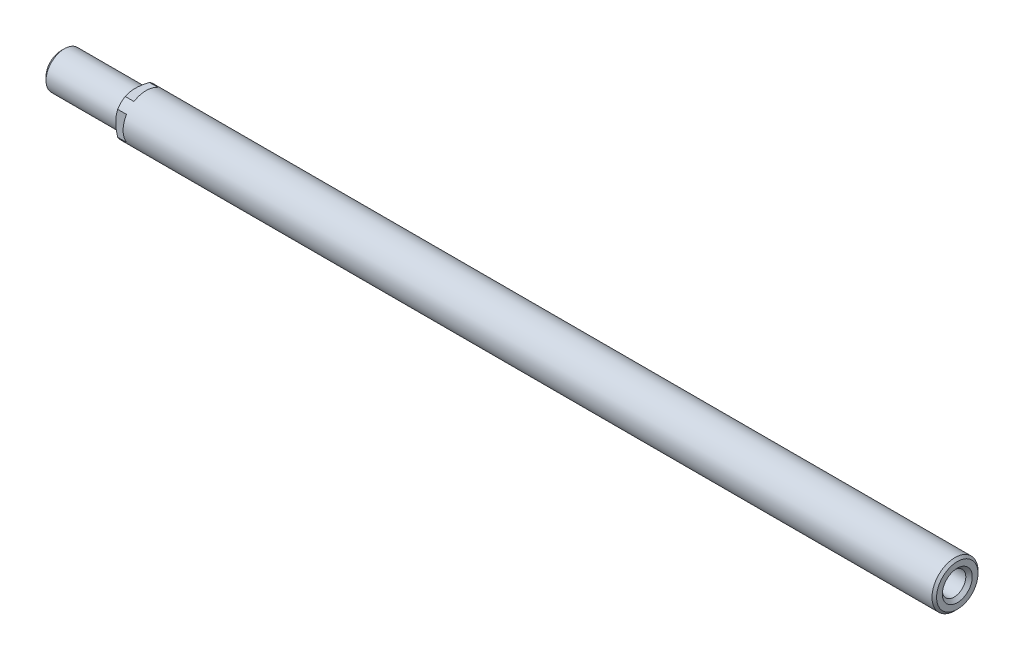
ISO-10303-21;
HEADER;
FILE_DESCRIPTION(('STEP AP214'),'2;1');
FILE_NAME('part.step','',(''),(''),'','','');
FILE_SCHEMA(('AUTOMOTIVE_DESIGN { 1 0 10303 214 1 1 1 1 }'));
ENDSEC;
DATA;
#1=APPLICATION_CONTEXT('core data for automotive mechanical design processes');
#2=APPLICATION_PROTOCOL_DEFINITION('international standard','automotive_design',2000,#1);
#3=PRODUCT_CONTEXT('',#1,'mechanical');
#4=PRODUCT('Part','Part','',(#3));
#5=PRODUCT_RELATED_PRODUCT_CATEGORY('part','',(#4));
#6=PRODUCT_DEFINITION_FORMATION('','',#4);
#7=PRODUCT_DEFINITION_CONTEXT('part definition',#1,'design');
#8=PRODUCT_DEFINITION('design','',#6,#7);
#9=PRODUCT_DEFINITION_SHAPE('','',#8);
#10=(LENGTH_UNIT() NAMED_UNIT(*) SI_UNIT(.MILLI.,.METRE.));
#11=(NAMED_UNIT(*) PLANE_ANGLE_UNIT() SI_UNIT($,.RADIAN.));
#12=(NAMED_UNIT(*) SI_UNIT($,.STERADIAN.) SOLID_ANGLE_UNIT());
#13=UNCERTAINTY_MEASURE_WITH_UNIT(LENGTH_MEASURE(1.E-05),#10,'distance_accuracy_value','');
#14=(GEOMETRIC_REPRESENTATION_CONTEXT(3) GLOBAL_UNCERTAINTY_ASSIGNED_CONTEXT((#13)) GLOBAL_UNIT_ASSIGNED_CONTEXT((#10,
#11,#12)) REPRESENTATION_CONTEXT('',''));
#15=CARTESIAN_POINT('',(0.,0.,0.));
#16=DIRECTION('',(0.,0.,1.));
#17=DIRECTION('',(1.,0.,0.));
#18=AXIS2_PLACEMENT_3D('',#15,#16,#17);
#19=CARTESIAN_POINT('',(-357.5,0.,94.635912223386));
#20=DIRECTION('',(1.,0.,0.));
#21=DIRECTION('',(0.,0.,-1.));
#22=AXIS2_PLACEMENT_3D('',#19,#20,#21);
#23=CYLINDRICAL_SURFACE('',#22,9.99999999999999);
#24=CARTESIAN_POINT('',(-1.,0.,94.635912223386));
#25=DIRECTION('',(1.,0.,0.));
#26=DIRECTION('',(0.,0.,-1.));
#27=AXIS2_PLACEMENT_3D('',#24,#25,#26);
#28=CIRCLE('',#27,9.99999999999999);
#29=CARTESIAN_POINT('',(-1.,0.,84.635912223386));
#30=VERTEX_POINT('',#29);
#31=EDGE_CURVE('E11',#30,#30,#28,.F.);
#32=ORIENTED_EDGE('',*,*,#31,.T.);
#33=EDGE_LOOP('',(#32));
#34=FACE_BOUND('',#33,.T.);
#35=CARTESIAN_POINT('',(-352.5,0.,94.635912223386));
#36=DIRECTION('',(-1.,0.,0.));
#37=DIRECTION('',(0.,0.,1.));
#38=AXIS2_PLACEMENT_3D('',#35,#36,#37);
#39=CIRCLE('',#38,9.99999999999999);
#40=CARTESIAN_POINT('',(-352.5,5.26782687642635,103.135912223386));
#41=VERTEX_POINT('',#40);
#42=CARTESIAN_POINT('',(-352.5,-5.26782687642635,103.135912223386));
#43=VERTEX_POINT('',#42);
#44=EDGE_CURVE('E232',#41,#43,#39,.F.);
#45=ORIENTED_EDGE('',*,*,#44,.T.);
#46=DIRECTION('',(1.,0.,0.));
#47=VECTOR('',#46,1.);
#48=CARTESIAN_POINT('',(-357.5,-5.26782687642635,103.135912223386));
#49=LINE('',#48,#47);
#50=CARTESIAN_POINT('',(-356.345299461621,-5.26782687642635,103.135912223386));
#51=VERTEX_POINT('',#50);
#52=EDGE_CURVE('E163',#43,#51,#49,.F.);
#53=ORIENTED_EDGE('',*,*,#52,.T.);
#54=CARTESIAN_POINT('',(-356.345299461621,0.,94.635912223386));
#55=DIRECTION('',(1.,0.,0.));
#56=DIRECTION('',(0.,0.,-1.));
#57=AXIS2_PLACEMENT_3D('',#54,#55,#56);
#58=CIRCLE('',#57,9.99999999999999);
#59=CARTESIAN_POINT('',(-356.345299461621,-8.5,99.9037390998124));
#60=VERTEX_POINT('',#59);
#61=EDGE_CURVE('E250',#51,#60,#58,.T.);
#62=ORIENTED_EDGE('',*,*,#61,.T.);
#63=DIRECTION('',(1.,0.,0.));
#64=VECTOR('',#63,1.);
#65=CARTESIAN_POINT('',(-357.5,-8.5,99.9037390998124));
#66=LINE('',#65,#64);
#67=CARTESIAN_POINT('',(-352.5,-8.5,99.9037390998124));
#68=VERTEX_POINT('',#67);
#69=EDGE_CURVE('E75',#60,#68,#66,.T.);
#70=ORIENTED_EDGE('',*,*,#69,.T.);
#71=CARTESIAN_POINT('',(-352.5,-8.5,89.3680853469597));
#72=VERTEX_POINT('',#71);
#73=EDGE_CURVE('E237',#68,#72,#39,.F.);
#74=ORIENTED_EDGE('',*,*,#73,.T.);
#75=DIRECTION('',(1.,0.,0.));
#76=VECTOR('',#75,1.);
#77=CARTESIAN_POINT('',(-357.5,-8.5,89.3680853469597));
#78=LINE('',#77,#76);
#79=CARTESIAN_POINT('',(-356.345299461621,-8.5,89.3680853469597));
#80=VERTEX_POINT('',#79);
#81=EDGE_CURVE('E157',#72,#80,#78,.F.);
#82=ORIENTED_EDGE('',*,*,#81,.T.);
#83=CARTESIAN_POINT('',(-356.345299461621,-5.26782687642637,86.135912223386));
#84=VERTEX_POINT('',#83);
#85=EDGE_CURVE('E175',#80,#84,#58,.T.);
#86=ORIENTED_EDGE('',*,*,#85,.T.);
#87=DIRECTION('',(1.,0.,0.));
#88=VECTOR('',#87,1.);
#89=CARTESIAN_POINT('',(-357.5,-5.26782687642637,86.135912223386));
#90=LINE('',#89,#88);
#91=CARTESIAN_POINT('',(-352.5,-5.26782687642637,86.135912223386));
#92=VERTEX_POINT('',#91);
#93=EDGE_CURVE('E67',#84,#92,#90,.T.);
#94=ORIENTED_EDGE('',*,*,#93,.T.);
#95=CARTESIAN_POINT('',(-352.5,5.26782687642637,86.135912223386));
#96=VERTEX_POINT('',#95);
#97=EDGE_CURVE('E231',#92,#96,#39,.F.);
#98=ORIENTED_EDGE('',*,*,#97,.T.);
#99=DIRECTION('',(1.,0.,0.));
#100=VECTOR('',#99,1.);
#101=CARTESIAN_POINT('',(-357.5,5.26782687642637,86.135912223386));
#102=LINE('',#101,#100);
#103=CARTESIAN_POINT('',(-356.345299461621,5.26782687642637,86.135912223386));
#104=VERTEX_POINT('',#103);
#105=EDGE_CURVE('E153',#96,#104,#102,.F.);
#106=ORIENTED_EDGE('',*,*,#105,.T.);
#107=CARTESIAN_POINT('',(-356.345299461621,8.5,89.3680853469597));
#108=VERTEX_POINT('',#107);
#109=EDGE_CURVE('E176',#104,#108,#58,.T.);
#110=ORIENTED_EDGE('',*,*,#109,.T.);
#111=DIRECTION('',(1.,0.,0.));
#112=VECTOR('',#111,1.);
#113=CARTESIAN_POINT('',(-357.5,8.5,89.3680853469597));
#114=LINE('',#113,#112);
#115=CARTESIAN_POINT('',(-352.5,8.5,89.3680853469597));
#116=VERTEX_POINT('',#115);
#117=EDGE_CURVE('E146',#108,#116,#114,.T.);
#118=ORIENTED_EDGE('',*,*,#117,.T.);
#119=CARTESIAN_POINT('',(-352.5,8.5,99.9037390998124));
#120=VERTEX_POINT('',#119);
#121=EDGE_CURVE('E224',#116,#120,#39,.F.);
#122=ORIENTED_EDGE('',*,*,#121,.T.);
#123=DIRECTION('',(1.,0.,0.));
#124=VECTOR('',#123,1.);
#125=CARTESIAN_POINT('',(-357.5,8.5,99.9037390998124));
#126=LINE('',#125,#124);
#127=CARTESIAN_POINT('',(-356.345299461621,8.5,99.9037390998124));
#128=VERTEX_POINT('',#127);
#129=EDGE_CURVE('E149',#120,#128,#126,.F.);
#130=ORIENTED_EDGE('',*,*,#129,.T.);
#131=CARTESIAN_POINT('',(-356.345299461621,5.26782687642635,103.135912223386));
#132=VERTEX_POINT('',#131);
#133=EDGE_CURVE('E180',#128,#132,#58,.T.);
#134=ORIENTED_EDGE('',*,*,#133,.T.);
#135=DIRECTION('',(1.,0.,0.));
#136=VECTOR('',#135,1.);
#137=CARTESIAN_POINT('',(-357.5,5.26782687642635,103.135912223386));
#138=LINE('',#137,#136);
#139=EDGE_CURVE('E160',#132,#41,#138,.T.);
#140=ORIENTED_EDGE('',*,*,#139,.T.);
#141=EDGE_LOOP('',(#45,#53,#62,#70,#74,#82,#86,#94,#98,#106,#110,#118,#122,#130,#134,#140));
#142=FACE_BOUND('',#141,.T.);
#143=ADVANCED_FACE('F51',(#34,#142),#23,.T.);
#144=CARTESIAN_POINT('',(-356.345299461621,0.,94.635912223386));
#145=DIRECTION('',(1.,0.,0.));
#146=DIRECTION('',(0.,0.,-1.));
#147=AXIS2_PLACEMENT_3D('',#144,#145,#146);
#148=CONICAL_SURFACE('',#147,9.99999999999999,1.0471975511966);
#149=CARTESIAN_POINT('',(-357.5,0.,94.635912223386));
#150=DIRECTION('',(-1.,0.,0.));
#151=DIRECTION('',(0.,0.,1.));
#152=AXIS2_PLACEMENT_3D('',#149,#150,#151);
#153=CIRCLE('',#152,8.);
#154=CARTESIAN_POINT('',(-357.5,0.,102.635912223386));
#155=VERTEX_POINT('',#154);
#156=EDGE_CURVE('E166',#155,#155,#153,.T.);
#157=ORIENTED_EDGE('',*,*,#156,.F.);
#158=EDGE_LOOP('',(#157));
#159=FACE_BOUND('',#158,.T.);
#160=ORIENTED_EDGE('',*,*,#61,.F.);
#161=CARTESIAN_POINT('',(-346.578430551977,-25.5393705588427,103.135912223386));
#162=CARTESIAN_POINT('',(-346.88872095938,-24.9729070449995,103.135912223386));
#163=CARTESIAN_POINT('',(-347.198253020489,-24.4060262850612,103.135912223386));
#164=CARTESIAN_POINT('',(-347.815395459564,-23.2712091900828,103.135912223386));
#165=CARTESIAN_POINT('',(-348.123005809204,-22.703272839642,103.135912223386));
#166=CARTESIAN_POINT('',(-348.736075081533,-21.5657980028676,103.135912223386));
#167=CARTESIAN_POINT('',(-349.041532598252,-20.9962587581142,103.135912223386));
#168=CARTESIAN_POINT('',(-349.649533659411,-19.8556300467387,103.135912223386));
#169=CARTESIAN_POINT('',(-349.952077221337,-19.2845405894463,103.135912223386));
#170=CARTESIAN_POINT('',(-350.560712653581,-18.1266942784125,103.135912223386));
#171=CARTESIAN_POINT('',(-350.866715309859,-17.5398904706723,103.135912223386));
#172=CARTESIAN_POINT('',(-351.473746674115,-16.3637159119743,103.135912223386));
#173=CARTESIAN_POINT('',(-351.774775418253,-15.7743451797169,103.135912223386));
#174=CARTESIAN_POINT('',(-352.370194397058,-14.5924439563174,103.135912223386));
#175=CARTESIAN_POINT('',(-352.664586319511,-13.9999143170002,103.135912223386));
#176=CARTESIAN_POINT('',(-353.244527216982,-12.8105448689461,103.135912223386));
#177=CARTESIAN_POINT('',(-353.530076517527,-12.2137052198756,103.135912223386));
#178=CARTESIAN_POINT('',(-353.953068508144,-11.3057728520148,103.135912223386));
#179=CARTESIAN_POINT('',(-354.095040084028,-10.9967903709382,103.135912223386));
#180=CARTESIAN_POINT('',(-354.375071413956,-10.3770602051242,103.135912223386));
#181=CARTESIAN_POINT('',(-354.513131236114,-10.066312551237,103.135912223386));
#182=CARTESIAN_POINT('',(-354.784588971702,-9.44267026988265,103.135912223386));
#183=CARTESIAN_POINT('',(-354.917985454887,-9.12977501834432,103.135912223386));
#184=CARTESIAN_POINT('',(-355.179067667644,-8.50160505824018,103.135912223386));
#185=CARTESIAN_POINT('',(-355.306753422883,-8.18633036037644,103.135912223386));
#186=CARTESIAN_POINT('',(-355.554509344887,-7.55468422952636,103.135912223386));
#187=CARTESIAN_POINT('',(-355.674615699213,-7.23832705183361,103.135912223386));
#188=CARTESIAN_POINT('',(-355.906386618322,-6.60250824678508,103.135912223386));
#189=CARTESIAN_POINT('',(-356.018050877312,-6.28304650744781,103.135912223386));
#190=CARTESIAN_POINT('',(-356.230988434202,-5.64075624076507,103.135912223386));
#191=CARTESIAN_POINT('',(-356.332264939071,-5.31792878661615,103.135912223386));
#192=CARTESIAN_POINT('',(-356.522151392389,-4.66860742238785,103.135912223386));
#193=CARTESIAN_POINT('',(-356.610762745368,-4.34211392320038,103.135912223386));
#194=CARTESIAN_POINT('',(-356.805979147793,-3.55015477793816,103.135912223386));
#195=CARTESIAN_POINT('',(-356.905003798878,-3.08274086083429,103.135912223386));
#196=CARTESIAN_POINT('',(-357.024727834735,-2.37685344658361,103.135912223386));
#197=CARTESIAN_POINT('',(-357.059831978699,-2.14078292846202,103.135912223386));
#198=CARTESIAN_POINT('',(-357.119583097318,-1.66730213116706,103.135912223386));
#199=CARTESIAN_POINT('',(-357.144230129539,-1.42989185937617,103.135912223386));
#200=CARTESIAN_POINT('',(-357.182286254934,-0.955269067012634,103.135912223386));
#201=CARTESIAN_POINT('',(-357.195746649176,-0.718060683523938,103.135912223386));
#202=CARTESIAN_POINT('',(-357.211222587448,-0.243270509663267,103.135912223386));
#203=CARTESIAN_POINT('',(-357.213238304856,-0.00568872500254447,103.135912223386));
#204=CARTESIAN_POINT('',(-357.205762188261,0.469307712390111,103.135912223386));
#205=CARTESIAN_POINT('',(-357.196269646519,0.706722353944568,103.135912223386));
#206=CARTESIAN_POINT('',(-357.16606461742,1.1808356650318,103.135912223386));
#207=CARTESIAN_POINT('',(-357.145351643041,1.417534303038,103.135912223386));
#208=CARTESIAN_POINT('',(-357.084178446681,1.97232961308989,103.135912223386));
#209=CARTESIAN_POINT('',(-357.039345763713,2.28994783869428,103.135912223386));
#210=CARTESIAN_POINT('',(-356.932344402941,2.92224742367171,103.135912223386));
#211=CARTESIAN_POINT('',(-356.870173045202,3.23692832126265,103.135912223386));
#212=CARTESIAN_POINT('',(-356.730824698104,3.86322644687351,103.135912223386));
#213=CARTESIAN_POINT('',(-356.653633641361,4.17484051281206,103.135912223386));
#214=CARTESIAN_POINT('',(-356.486651663727,4.79463366863872,103.135912223386));
#215=CARTESIAN_POINT('',(-356.396861052273,5.10281284268496,103.135912223386));
#216=CARTESIAN_POINT('',(-356.204968381648,5.72187175251727,103.135912223386));
#217=CARTESIAN_POINT('',(-356.102660726691,6.03268731743341,103.135912223386));
#218=CARTESIAN_POINT('',(-355.889108917124,6.6512158593428,103.135912223386));
#219=CARTESIAN_POINT('',(-355.77786472633,6.95892882376789,103.135912223386));
#220=CARTESIAN_POINT('',(-355.548096348611,7.57143913080665,103.135912223386));
#221=CARTESIAN_POINT('',(-355.429575782074,7.87623783755669,103.135912223386));
#222=CARTESIAN_POINT('',(-355.186501302108,8.48340799143823,103.135912223386));
#223=CARTESIAN_POINT('',(-355.061947436741,8.78577945788333,103.135912223386));
#224=CARTESIAN_POINT('',(-354.779945127132,9.45460468626431,103.135912223386));
#225=CARTESIAN_POINT('',(-354.621280951485,9.82054485979376,103.135912223386));
#226=CARTESIAN_POINT('',(-354.298022166461,10.5498025588548,103.135912223386));
#227=CARTESIAN_POINT('',(-354.133427338342,10.9131199870566,103.135912223386));
#228=CARTESIAN_POINT('',(-353.799429387273,11.6375869039058,103.135912223386));
#229=CARTESIAN_POINT('',(-353.630025681631,11.9987361233525,103.135912223386));
#230=CARTESIAN_POINT('',(-353.287308687875,12.7191774642907,103.135912223386));
#231=CARTESIAN_POINT('',(-353.113995344823,13.0784695595983,103.135912223386));
#232=CARTESIAN_POINT('',(-352.764017438643,13.7957523410067,103.135912223386));
#233=CARTESIAN_POINT('',(-352.587350439408,14.1537418369145,103.135912223386));
#234=CARTESIAN_POINT('',(-352.23133036454,14.8683836892306,103.135912223386));
#235=CARTESIAN_POINT('',(-352.051977272124,15.2250360372667,103.135912223386));
#236=CARTESIAN_POINT('',(-351.510588963077,16.2932313322632,103.135912223386));
#237=CARTESIAN_POINT('',(-351.145195400773,17.0030722182502,103.135912223386));
#238=CARTESIAN_POINT('',(-350.434505035452,18.3684187926222,103.135912223386));
#239=CARTESIAN_POINT('',(-350.089654797101,19.0241577848791,103.135912223386));
#240=CARTESIAN_POINT('',(-349.395723029492,20.3334100670535,103.135912223386));
#241=CARTESIAN_POINT('',(-349.046641406976,20.9869233075085,103.135912223386));
#242=CARTESIAN_POINT('',(-348.345824944396,22.2910652690949,103.135912223386));
#243=CARTESIAN_POINT('',(-347.994095744745,22.9416970254446,103.135912223386));
#244=CARTESIAN_POINT('',(-347.288047371804,24.2415224317954,103.135912223386));
#245=CARTESIAN_POINT('',(-346.933728296925,24.890716135232,103.135912223386));
#246=CARTESIAN_POINT('',(-346.578430551977,25.5393705588427,103.135912223386));
#247=B_SPLINE_CURVE_WITH_KNOTS('',3,(#161,#162,#163,#164,#165,#166,#167,#168,#169,#170,#171,
#172,#173,#174,#175,#176,#177,#178,#179,#180,#181,#182,#183,#184,#185,#186,#187,#188,#189,#190,
#191,#192,#193,#194,#195,#196,#197,#198,#199,#200,#201,#202,#203,#204,#205,#206,#207,#208,#209,
#210,#211,#212,#213,#214,#215,#216,#217,#218,#219,#220,#221,#222,#223,#224,#225,#226,#227,#228,
#229,#230,#231,#232,#233,#234,#235,#236,#237,#238,#239,#240,#241,#242,#243,#244,#245,#246),
.UNSPECIFIED.,.F.,.F.,(4,2,2,2,2,2,2,2,2,2,2,2,2,2,2,2,2,2,2,2,2,2,2,2,2,2,2,2,2,2,2,2,2,2,2,2,
2,2,2,2,2,2,4),(0.,1.93764201924687,3.87531253339333,5.81414901128492,7.75297384646834,
9.73834961566885,11.7237109452773,13.7085615557447,15.6933390099207,16.7134329930713,
17.7335092024192,18.7538955718854,19.7742773546823,20.7893468019989,21.8044529997608,
22.8192448585932,23.8339240924312,25.2657750188337,25.9815821593615,26.6973853594056,
27.4098875385053,28.1223789237693,28.8349141282288,29.5474802627257,30.5092091049155,
31.4710866782679,32.4338695163731,33.3966287133014,34.378125165777,35.3596255925462,
36.340641566894,37.3216497275217,38.5181507959301,39.7146960404615,40.9113868947096,
42.1080945754187,43.305707602275,44.5033281153091,46.8983696637647,49.1210174951155,
51.3437144018014,53.5625628305964,55.7813273794478),.UNSPECIFIED.);
#248=EDGE_CURVE('E217',#51,#132,#247,.T.);
#249=ORIENTED_EDGE('',*,*,#248,.T.);
#250=ORIENTED_EDGE('',*,*,#133,.F.);
#251=CARTESIAN_POINT('',(-346.578430551977,8.5,120.175282782229));
#252=CARTESIAN_POINT('',(-346.88872095938,8.5,119.608819268386));
#253=CARTESIAN_POINT('',(-347.198253020489,8.5,119.041938508447));
#254=CARTESIAN_POINT('',(-347.815395459564,8.5,117.907121413469));
#255=CARTESIAN_POINT('',(-348.123005809204,8.5,117.339185063028));
#256=CARTESIAN_POINT('',(-348.736075081533,8.5,116.201710226254));
#257=CARTESIAN_POINT('',(-349.041532598252,8.5,115.6321709815));
#258=CARTESIAN_POINT('',(-349.649533659411,8.5,114.491542270125));
#259=CARTESIAN_POINT('',(-349.952077221337,8.5,113.920452812832));
#260=CARTESIAN_POINT('',(-350.560712653581,8.5,112.762606501799));
#261=CARTESIAN_POINT('',(-350.866715309859,8.5,112.175802694058));
#262=CARTESIAN_POINT('',(-351.473746674115,8.5,110.99962813536));
#263=CARTESIAN_POINT('',(-351.774775418253,8.5,110.410257403103));
#264=CARTESIAN_POINT('',(-352.370194397058,8.5,109.228356179703));
#265=CARTESIAN_POINT('',(-352.664586319511,8.5,108.635826540386));
#266=CARTESIAN_POINT('',(-353.244527216982,8.5,107.446457092332));
#267=CARTESIAN_POINT('',(-353.530076517527,8.5,106.849617443262));
#268=CARTESIAN_POINT('',(-353.953068508144,8.5,105.941685075401));
#269=CARTESIAN_POINT('',(-354.095040084028,8.5,105.632702594324));
#270=CARTESIAN_POINT('',(-354.375071413956,8.5,105.01297242851));
#271=CARTESIAN_POINT('',(-354.513131236114,8.5,104.702224774623));
#272=CARTESIAN_POINT('',(-354.784588971702,8.5,104.078582493269));
#273=CARTESIAN_POINT('',(-354.917985454887,8.5,103.76568724173));
#274=CARTESIAN_POINT('',(-355.179067667644,8.5,103.137517281626));
#275=CARTESIAN_POINT('',(-355.306753422883,8.5,102.822242583762));
#276=CARTESIAN_POINT('',(-355.554509344887,8.5,102.190596452912));
#277=CARTESIAN_POINT('',(-355.674615699213,8.5,101.87423927522));
#278=CARTESIAN_POINT('',(-355.906386618322,8.5,101.238420470171));
#279=CARTESIAN_POINT('',(-356.018050877312,8.5,100.918958730834));
#280=CARTESIAN_POINT('',(-356.230988434202,8.5,100.276668464151));
#281=CARTESIAN_POINT('',(-356.332264939071,8.5,99.9538410100022));
#282=CARTESIAN_POINT('',(-356.522151392389,8.5,99.3045196457739));
#283=CARTESIAN_POINT('',(-356.610762745368,8.5,98.9780261465864));
#284=CARTESIAN_POINT('',(-356.805979147793,8.5,98.1860670013242));
#285=CARTESIAN_POINT('',(-356.905003798878,8.5,97.7186530842203));
#286=CARTESIAN_POINT('',(-357.024727834735,8.5,97.0127656699697));
#287=CARTESIAN_POINT('',(-357.059831978699,8.5,96.776695151848));
#288=CARTESIAN_POINT('',(-357.119583097318,8.5,96.3032143545531));
#289=CARTESIAN_POINT('',(-357.144230129539,8.5,96.0658040827622));
#290=CARTESIAN_POINT('',(-357.182286254934,8.5,95.5911812903987));
#291=CARTESIAN_POINT('',(-357.195746649176,8.5,95.35397290691));
#292=CARTESIAN_POINT('',(-357.211222587448,8.5,94.8791827330493));
#293=CARTESIAN_POINT('',(-357.213238304856,8.5,94.6416009483886));
#294=CARTESIAN_POINT('',(-357.205762188261,8.5,94.1666045109959));
#295=CARTESIAN_POINT('',(-357.196269646519,8.5,93.9291898694415));
#296=CARTESIAN_POINT('',(-357.16606461742,8.5,93.4550765583542));
#297=CARTESIAN_POINT('',(-357.145351643041,8.5,93.218377920348));
#298=CARTESIAN_POINT('',(-357.084178446681,8.5,92.6635826102961));
#299=CARTESIAN_POINT('',(-357.039345763713,8.5,92.3459643846917));
#300=CARTESIAN_POINT('',(-356.932344402941,8.5,91.7136647997143));
#301=CARTESIAN_POINT('',(-356.870173045202,8.5,91.3989839021234));
#302=CARTESIAN_POINT('',(-356.730824698104,8.5,90.7726857765125));
#303=CARTESIAN_POINT('',(-356.653633641361,8.5,90.4610717105739));
#304=CARTESIAN_POINT('',(-356.486651663727,8.5,89.8412785547473));
#305=CARTESIAN_POINT('',(-356.396861052273,8.5,89.5330993807011));
#306=CARTESIAN_POINT('',(-356.204968381648,8.5,88.9140404708687));
#307=CARTESIAN_POINT('',(-356.102660726691,8.5,88.6032249059526));
#308=CARTESIAN_POINT('',(-355.889108917124,8.5,87.9846963640432));
#309=CARTESIAN_POINT('',(-355.77786472633,8.5,87.6769833996181));
#310=CARTESIAN_POINT('',(-355.548096348611,8.5,87.0644730925794));
#311=CARTESIAN_POINT('',(-355.429575782074,8.5,86.7596743858294));
#312=CARTESIAN_POINT('',(-355.186501302108,8.5,86.1525042319478));
#313=CARTESIAN_POINT('',(-355.061947436741,8.5,85.8501327655027));
#314=CARTESIAN_POINT('',(-354.779945127132,8.5,85.1813075371217));
#315=CARTESIAN_POINT('',(-354.621280951485,8.5,84.8153673635923));
#316=CARTESIAN_POINT('',(-354.298022166461,8.5,84.0861096645312));
#317=CARTESIAN_POINT('',(-354.133427338342,8.5,83.7227922363295));
#318=CARTESIAN_POINT('',(-353.799429387273,8.5,82.9983253194803));
#319=CARTESIAN_POINT('',(-353.630025681631,8.5,82.6371761000335));
#320=CARTESIAN_POINT('',(-353.287308687875,8.5,81.9167347590954));
#321=CARTESIAN_POINT('',(-353.113995344823,8.5,81.5574426637877));
#322=CARTESIAN_POINT('',(-352.764017438643,8.5,80.8401598823794));
#323=CARTESIAN_POINT('',(-352.587350439408,8.5,80.4821703864716));
#324=CARTESIAN_POINT('',(-352.23133036454,8.5,79.7675285341554));
#325=CARTESIAN_POINT('',(-352.051977272124,8.5,79.4108761861194));
#326=CARTESIAN_POINT('',(-351.510588963077,8.5,78.3426808911228));
#327=CARTESIAN_POINT('',(-351.145195400773,8.5,77.6328400051358));
#328=CARTESIAN_POINT('',(-350.434505035452,8.5,76.2674934307638));
#329=CARTESIAN_POINT('',(-350.089654797101,8.5,75.6117544385069));
#330=CARTESIAN_POINT('',(-349.395723029492,8.5,74.3025021563325));
#331=CARTESIAN_POINT('',(-349.046641406976,8.5,73.6489889158775));
#332=CARTESIAN_POINT('',(-348.345824944396,8.5,72.3448469542911));
#333=CARTESIAN_POINT('',(-347.994095744745,8.5,71.6942151979414));
#334=CARTESIAN_POINT('',(-347.288047371803,8.5,70.3943897915906));
#335=CARTESIAN_POINT('',(-346.933728296925,8.5,69.745196088154));
#336=CARTESIAN_POINT('',(-346.578430551977,8.5,69.0965416645433));
#337=B_SPLINE_CURVE_WITH_KNOTS('',3,(#251,#252,#253,#254,#255,#256,#257,#258,#259,#260,#261,
#262,#263,#264,#265,#266,#267,#268,#269,#270,#271,#272,#273,#274,#275,#276,#277,#278,#279,#280,
#281,#282,#283,#284,#285,#286,#287,#288,#289,#290,#291,#292,#293,#294,#295,#296,#297,#298,#299,
#300,#301,#302,#303,#304,#305,#306,#307,#308,#309,#310,#311,#312,#313,#314,#315,#316,#317,#318,
#319,#320,#321,#322,#323,#324,#325,#326,#327,#328,#329,#330,#331,#332,#333,#334,#335,#336),
.UNSPECIFIED.,.F.,.F.,(4,2,2,2,2,2,2,2,2,2,2,2,2,2,2,2,2,2,2,2,2,2,2,2,2,2,2,2,2,2,2,2,2,2,2,2,
2,2,2,2,2,2,4),(0.,1.93764201924687,3.87531253339333,5.81414901128494,7.75297384646835,
9.73834961566885,11.7237109452773,13.7085615557447,15.6933390099207,16.7134329930713,
17.7335092024192,18.7538955718854,19.7742773546823,20.7893468019989,21.8044529997608,
22.8192448585932,23.8339240924312,25.2657750188337,25.9815821593615,26.6973853594056,
27.4098875385053,28.1223789237693,28.8349141282288,29.5474802627257,30.5092091049155,
31.4710866782679,32.4338695163731,33.3966287133014,34.3781251657771,35.3596255925462,
36.340641566894,37.3216497275218,38.5181507959301,39.7146960404614,40.9113868947096,
42.1080945754187,43.3057076022751,44.5033281153091,46.8983696637648,49.1210174951155,
51.3437144018015,53.5625628305965,55.7813273794479),.UNSPECIFIED.);
#338=EDGE_CURVE('E179',#128,#108,#337,.T.);
#339=ORIENTED_EDGE('',*,*,#338,.T.);
#340=ORIENTED_EDGE('',*,*,#109,.F.);
#341=CARTESIAN_POINT('',(-346.578430551977,25.5393705588427,86.135912223386));
#342=CARTESIAN_POINT('',(-346.88872095938,24.9729070449995,86.135912223386));
#343=CARTESIAN_POINT('',(-347.198253020489,24.4060262850612,86.135912223386));
#344=CARTESIAN_POINT('',(-347.815395459564,23.2712091900828,86.135912223386));
#345=CARTESIAN_POINT('',(-348.123005809204,22.7032728396419,86.135912223386));
#346=CARTESIAN_POINT('',(-348.736075081533,21.5657980028675,86.135912223386));
#347=CARTESIAN_POINT('',(-349.041532598252,20.9962587581141,86.135912223386));
#348=CARTESIAN_POINT('',(-349.649533659411,19.8556300467387,86.135912223386));
#349=CARTESIAN_POINT('',(-349.952077221337,19.2845405894463,86.135912223386));
#350=CARTESIAN_POINT('',(-350.560712653581,18.1266942784125,86.135912223386));
#351=CARTESIAN_POINT('',(-350.866715309859,17.5398904706722,86.135912223386));
#352=CARTESIAN_POINT('',(-351.473746674115,16.3637159119742,86.135912223386));
#353=CARTESIAN_POINT('',(-351.774775418253,15.7743451797168,86.135912223386));
#354=CARTESIAN_POINT('',(-352.370194397058,14.5924439563173,86.135912223386));
#355=CARTESIAN_POINT('',(-352.664586319511,13.9999143170001,86.135912223386));
#356=CARTESIAN_POINT('',(-353.244527216982,12.8105448689461,86.135912223386));
#357=CARTESIAN_POINT('',(-353.530076517527,12.2137052198755,86.135912223386));
#358=CARTESIAN_POINT('',(-353.953068508144,11.3057728520148,86.135912223386));
#359=CARTESIAN_POINT('',(-354.095040084028,10.9967903709381,86.135912223386));
#360=CARTESIAN_POINT('',(-354.375071413956,10.3770602051241,86.135912223386));
#361=CARTESIAN_POINT('',(-354.513131236114,10.0663125512369,86.135912223386));
#362=CARTESIAN_POINT('',(-354.784588971702,9.44267026988262,86.135912223386));
#363=CARTESIAN_POINT('',(-354.917985454887,9.1297750183443,86.135912223386));
#364=CARTESIAN_POINT('',(-355.179067667644,8.50160505824018,86.135912223386));
#365=CARTESIAN_POINT('',(-355.306753422883,8.18633036037643,86.135912223386));
#366=CARTESIAN_POINT('',(-355.554509344887,7.55468422952635,86.135912223386));
#367=CARTESIAN_POINT('',(-355.674615699213,7.23832705183361,86.135912223386));
#368=CARTESIAN_POINT('',(-355.906386618322,6.60250824678508,86.135912223386));
#369=CARTESIAN_POINT('',(-356.018050877312,6.28304650744781,86.135912223386));
#370=CARTESIAN_POINT('',(-356.230988434202,5.64075624076506,86.135912223386));
#371=CARTESIAN_POINT('',(-356.332264939071,5.31792878661614,86.135912223386));
#372=CARTESIAN_POINT('',(-356.522151392389,4.66860742238785,86.135912223386));
#373=CARTESIAN_POINT('',(-356.610762745368,4.34211392320037,86.135912223386));
#374=CARTESIAN_POINT('',(-356.805979147793,3.55015477793816,86.135912223386));
#375=CARTESIAN_POINT('',(-356.905003798878,3.08274086083429,86.135912223386));
#376=CARTESIAN_POINT('',(-357.024727834735,2.37685344658362,86.135912223386));
#377=CARTESIAN_POINT('',(-357.059831978699,2.14078292846202,86.135912223386));
#378=CARTESIAN_POINT('',(-357.119583097318,1.66730213116706,86.135912223386));
#379=CARTESIAN_POINT('',(-357.144230129539,1.42989185937616,86.135912223386));
#380=CARTESIAN_POINT('',(-357.182286254934,0.95526906701263,86.135912223386));
#381=CARTESIAN_POINT('',(-357.195746649176,0.718060683523935,86.135912223386));
#382=CARTESIAN_POINT('',(-357.211222587448,0.243270509663266,86.135912223386));
#383=CARTESIAN_POINT('',(-357.213238304856,0.00568872500254447,86.135912223386));
#384=CARTESIAN_POINT('',(-357.205762188261,-0.469307712390109,86.135912223386));
#385=CARTESIAN_POINT('',(-357.196269646519,-0.706722353944565,86.135912223386));
#386=CARTESIAN_POINT('',(-357.16606461742,-1.1808356650318,86.135912223386));
#387=CARTESIAN_POINT('',(-357.145351643041,-1.417534303038,86.135912223386));
#388=CARTESIAN_POINT('',(-357.084178446681,-1.97232961308988,86.135912223386));
#389=CARTESIAN_POINT('',(-357.039345763713,-2.28994783869427,86.135912223386));
#390=CARTESIAN_POINT('',(-356.932344402941,-2.92224742367169,86.135912223386));
#391=CARTESIAN_POINT('',(-356.870173045202,-3.23692832126264,86.135912223386));
#392=CARTESIAN_POINT('',(-356.730824698104,-3.8632264468735,86.135912223386));
#393=CARTESIAN_POINT('',(-356.653633641361,-4.17484051281205,86.135912223386));
#394=CARTESIAN_POINT('',(-356.486651663728,-4.79463366863872,86.135912223386));
#395=CARTESIAN_POINT('',(-356.396861052273,-5.10281284268495,86.135912223386));
#396=CARTESIAN_POINT('',(-356.204968381648,-5.72187175251726,86.135912223386));
#397=CARTESIAN_POINT('',(-356.102660726691,-6.03268731743339,86.135912223386));
#398=CARTESIAN_POINT('',(-355.889108917124,-6.65121585934277,86.135912223386));
#399=CARTESIAN_POINT('',(-355.77786472633,-6.95892882376786,86.135912223386));
#400=CARTESIAN_POINT('',(-355.548096348611,-7.57143913080664,86.135912223386));
#401=CARTESIAN_POINT('',(-355.429575782074,-7.87623783755669,86.135912223386));
#402=CARTESIAN_POINT('',(-355.186501302108,-8.48340799143823,86.135912223386));
#403=CARTESIAN_POINT('',(-355.061947436741,-8.78577945788333,86.135912223386));
#404=CARTESIAN_POINT('',(-354.779945127132,-9.45460468626429,86.135912223386));
#405=CARTESIAN_POINT('',(-354.621280951485,-9.82054485979374,86.135912223386));
#406=CARTESIAN_POINT('',(-354.298022166461,-10.5498025588548,86.135912223386));
#407=CARTESIAN_POINT('',(-354.133427338342,-10.9131199870565,86.135912223386));
#408=CARTESIAN_POINT('',(-353.799429387273,-11.6375869039057,86.135912223386));
#409=CARTESIAN_POINT('',(-353.630025681631,-11.9987361233525,86.135912223386));
#410=CARTESIAN_POINT('',(-353.287308687875,-12.7191774642906,86.135912223386));
#411=CARTESIAN_POINT('',(-353.113995344823,-13.0784695595983,86.135912223386));
#412=CARTESIAN_POINT('',(-352.764017438643,-13.7957523410066,86.135912223386));
#413=CARTESIAN_POINT('',(-352.587350439408,-14.1537418369144,86.135912223386));
#414=CARTESIAN_POINT('',(-352.23133036454,-14.8683836892306,86.135912223386));
#415=CARTESIAN_POINT('',(-352.051977272124,-15.2250360372666,86.135912223386));
#416=CARTESIAN_POINT('',(-351.510588963077,-16.2932313322632,86.135912223386));
#417=CARTESIAN_POINT('',(-351.145195400773,-17.0030722182502,86.135912223386));
#418=CARTESIAN_POINT('',(-350.434505035452,-18.3684187926222,86.135912223386));
#419=CARTESIAN_POINT('',(-350.089654797101,-19.0241577848791,86.135912223386));
#420=CARTESIAN_POINT('',(-349.395723029492,-20.3334100670534,86.135912223386));
#421=CARTESIAN_POINT('',(-349.046641406976,-20.9869233075085,86.135912223386));
#422=CARTESIAN_POINT('',(-348.345824944396,-22.2910652690949,86.135912223386));
#423=CARTESIAN_POINT('',(-347.994095744745,-22.9416970254445,86.135912223386));
#424=CARTESIAN_POINT('',(-347.288047371804,-24.2415224317953,86.135912223386));
#425=CARTESIAN_POINT('',(-346.933728296925,-24.890716135232,86.135912223386));
#426=CARTESIAN_POINT('',(-346.578430551977,-25.5393705588427,86.135912223386));
#427=B_SPLINE_CURVE_WITH_KNOTS('',3,(#341,#342,#343,#344,#345,#346,#347,#348,#349,#350,#351,
#352,#353,#354,#355,#356,#357,#358,#359,#360,#361,#362,#363,#364,#365,#366,#367,#368,#369,#370,
#371,#372,#373,#374,#375,#376,#377,#378,#379,#380,#381,#382,#383,#384,#385,#386,#387,#388,#389,
#390,#391,#392,#393,#394,#395,#396,#397,#398,#399,#400,#401,#402,#403,#404,#405,#406,#407,#408,
#409,#410,#411,#412,#413,#414,#415,#416,#417,#418,#419,#420,#421,#422,#423,#424,#425,#426),
.UNSPECIFIED.,.F.,.F.,(4,2,2,2,2,2,2,2,2,2,2,2,2,2,2,2,2,2,2,2,2,2,2,2,2,2,2,2,2,2,2,2,2,2,2,2,
2,2,2,2,2,2,4),(0.,1.93764201924687,3.87531253339335,5.81414901128492,7.75297384646837,
9.7383496156689,11.7237109452773,13.7085615557448,15.6933390099207,16.7134329930713,
17.7335092024192,18.7538955718854,19.7742773546822,20.7893468019989,21.8044529997608,
22.8192448585932,23.8339240924311,25.2657750188336,25.9815821593615,26.6973853594056,
27.4098875385053,28.1223789237692,28.8349141282288,29.5474802627256,30.5092091049154,
31.4710866782678,32.433869516373,33.3966287133013,34.3781251657769,35.3596255925461,
36.340641566894,37.3216497275217,38.5181507959301,39.7146960404614,40.9113868947095,
42.1080945754186,43.305707602275,44.503328115309,46.8983696637647,49.1210174951154,
51.3437144018013,53.5625628305963,55.7813273794477),.UNSPECIFIED.);
#428=EDGE_CURVE('E188',#104,#84,#427,.T.);
#429=ORIENTED_EDGE('',*,*,#428,.T.);
#430=ORIENTED_EDGE('',*,*,#85,.F.);
#431=CARTESIAN_POINT('',(-346.578430551977,-8.5,69.0965416645433));
#432=CARTESIAN_POINT('',(-346.88872095938,-8.5,69.6630051783865));
#433=CARTESIAN_POINT('',(-347.198253020489,-8.5,70.2298859383248));
#434=CARTESIAN_POINT('',(-347.815395459564,-8.5,71.3647030333032));
#435=CARTESIAN_POINT('',(-348.123005809204,-8.5,71.932639383744));
#436=CARTESIAN_POINT('',(-348.736075081533,-8.5,73.0701142205184));
#437=CARTESIAN_POINT('',(-349.041532598252,-8.5,73.6396534652719));
#438=CARTESIAN_POINT('',(-349.649533659411,-8.5,74.7802821766473));
#439=CARTESIAN_POINT('',(-349.952077221337,-8.5,75.3513716339397));
#440=CARTESIAN_POINT('',(-350.560712653581,-8.5,76.5092179449735));
#441=CARTESIAN_POINT('',(-350.866715309859,-8.5,77.0960217527137));
#442=CARTESIAN_POINT('',(-351.473746674115,-8.5,78.2721963114117));
#443=CARTESIAN_POINT('',(-351.774775418253,-8.5,78.8615670436692));
#444=CARTESIAN_POINT('',(-352.370194397058,-8.5,80.0434682670686));
#445=CARTESIAN_POINT('',(-352.664586319511,-8.5,80.6359979063859));
#446=CARTESIAN_POINT('',(-353.244527216982,-8.5,81.8253673544399));
#447=CARTESIAN_POINT('',(-353.530076517527,-8.5,82.4222070035104));
#448=CARTESIAN_POINT('',(-353.953068508144,-8.5,83.3301393713712));
#449=CARTESIAN_POINT('',(-354.095040084028,-8.5,83.6391218524478));
#450=CARTESIAN_POINT('',(-354.375071413956,-8.5,84.2588520182619));
#451=CARTESIAN_POINT('',(-354.513131236114,-8.5,84.5695996721491));
#452=CARTESIAN_POINT('',(-354.784588971702,-8.5,85.1932419535034));
#453=CARTESIAN_POINT('',(-354.917985454887,-8.5,85.5061372050417));
#454=CARTESIAN_POINT('',(-355.179067667644,-8.5,86.1343071651458));
#455=CARTESIAN_POINT('',(-355.306753422883,-8.5,86.4495818630096));
#456=CARTESIAN_POINT('',(-355.554509344887,-8.5,87.0812279938596));
#457=CARTESIAN_POINT('',(-355.674615699213,-8.5,87.3975851715524));
#458=CARTESIAN_POINT('',(-355.906386618322,-8.5,88.0334039766009));
#459=CARTESIAN_POINT('',(-356.018050877312,-8.5,88.3528657159382));
#460=CARTESIAN_POINT('',(-356.230988434202,-8.5,88.9951559826209));
#461=CARTESIAN_POINT('',(-356.332264939071,-8.5,89.3179834367698));
#462=CARTESIAN_POINT('',(-356.522151392389,-8.5,89.9673048009981));
#463=CARTESIAN_POINT('',(-356.610762745368,-8.5,90.2937983001856));
#464=CARTESIAN_POINT('',(-356.805979147793,-8.5,91.0857574454478));
#465=CARTESIAN_POINT('',(-356.905003798878,-8.5,91.5531713625517));
#466=CARTESIAN_POINT('',(-357.024727834735,-8.5,92.2590587768024));
#467=CARTESIAN_POINT('',(-357.059831978699,-8.5,92.495129294924));
#468=CARTESIAN_POINT('',(-357.119583097318,-8.5,92.9686100922189));
#469=CARTESIAN_POINT('',(-357.144230129539,-8.5,93.2060203640098));
#470=CARTESIAN_POINT('',(-357.182286254934,-8.5,93.6806431563733));
#471=CARTESIAN_POINT('',(-357.195746649176,-8.5,93.917851539862));
#472=CARTESIAN_POINT('',(-357.211222587448,-8.5,94.3926417137227));
#473=CARTESIAN_POINT('',(-357.213238304856,-8.5,94.6302234983834));
#474=CARTESIAN_POINT('',(-357.205762188261,-8.5,95.1052199357761));
#475=CARTESIAN_POINT('',(-357.196269646519,-8.5,95.3426345773305));
#476=CARTESIAN_POINT('',(-357.16606461742,-8.5,95.8167478884178));
#477=CARTESIAN_POINT('',(-357.145351643041,-8.5,96.053446526424));
#478=CARTESIAN_POINT('',(-357.084178446681,-8.5,96.6082418364759));
#479=CARTESIAN_POINT('',(-357.039345763713,-8.5,96.9258600620803));
#480=CARTESIAN_POINT('',(-356.932344402941,-8.5,97.5581596470577));
#481=CARTESIAN_POINT('',(-356.870173045202,-8.5,97.8728405446486));
#482=CARTESIAN_POINT('',(-356.730824698104,-8.5,98.4991386702595));
#483=CARTESIAN_POINT('',(-356.653633641361,-8.5,98.810752736198));
#484=CARTESIAN_POINT('',(-356.486651663728,-8.5,99.4305458920247));
#485=CARTESIAN_POINT('',(-356.396861052273,-8.5,99.7387250660709));
#486=CARTESIAN_POINT('',(-356.204968381648,-8.5,100.357783975903));
#487=CARTESIAN_POINT('',(-356.102660726691,-8.5,100.668599540819));
#488=CARTESIAN_POINT('',(-355.889108917124,-8.5,101.287128082729));
#489=CARTESIAN_POINT('',(-355.77786472633,-8.5,101.594841047154));
#490=CARTESIAN_POINT('',(-355.548096348611,-8.5,102.207351354193));
#491=CARTESIAN_POINT('',(-355.429575782074,-8.5,102.512150060943));
#492=CARTESIAN_POINT('',(-355.186501302108,-8.5,103.119320214824));
#493=CARTESIAN_POINT('',(-355.061947436741,-8.5,103.421691681269));
#494=CARTESIAN_POINT('',(-354.779945127132,-8.5,104.09051690965));
#495=CARTESIAN_POINT('',(-354.621280951485,-8.5,104.45645708318));
#496=CARTESIAN_POINT('',(-354.298022166462,-8.5,105.185714782241));
#497=CARTESIAN_POINT('',(-354.133427338342,-8.5,105.549032210442));
#498=CARTESIAN_POINT('',(-353.799429387273,-8.5,106.273499127292));
#499=CARTESIAN_POINT('',(-353.630025681631,-8.5,106.634648346738));
#500=CARTESIAN_POINT('',(-353.287308687875,-8.5,107.355089687677));
#501=CARTESIAN_POINT('',(-353.113995344823,-8.5,107.714381782984));
#502=CARTESIAN_POINT('',(-352.764017438643,-8.5,108.431664564393));
#503=CARTESIAN_POINT('',(-352.587350439408,-8.5,108.7896540603));
#504=CARTESIAN_POINT('',(-352.23133036454,-8.5,109.504295912617));
#505=CARTESIAN_POINT('',(-352.051977272124,-8.5,109.860948260653));
#506=CARTESIAN_POINT('',(-351.510588963077,-8.5,110.929143555649));
#507=CARTESIAN_POINT('',(-351.145195400773,-8.5,111.638984441636));
#508=CARTESIAN_POINT('',(-350.434505035452,-8.5,113.004331016008));
#509=CARTESIAN_POINT('',(-350.089654797101,-8.5,113.660070008265));
#510=CARTESIAN_POINT('',(-349.395723029492,-8.5,114.969322290439));
#511=CARTESIAN_POINT('',(-349.046641406976,-8.5,115.622835530895));
#512=CARTESIAN_POINT('',(-348.345824944396,-8.5,116.926977492481));
#513=CARTESIAN_POINT('',(-347.994095744745,-8.5,117.577609248831));
#514=CARTESIAN_POINT('',(-347.288047371804,-8.5,118.877434655181));
#515=CARTESIAN_POINT('',(-346.933728296925,-8.5,119.526628358618));
#516=CARTESIAN_POINT('',(-346.578430551977,-8.5,120.175282782229));
#517=B_SPLINE_CURVE_WITH_KNOTS('',3,(#431,#432,#433,#434,#435,#436,#437,#438,#439,#440,#441,
#442,#443,#444,#445,#446,#447,#448,#449,#450,#451,#452,#453,#454,#455,#456,#457,#458,#459,#460,
#461,#462,#463,#464,#465,#466,#467,#468,#469,#470,#471,#472,#473,#474,#475,#476,#477,#478,#479,
#480,#481,#482,#483,#484,#485,#486,#487,#488,#489,#490,#491,#492,#493,#494,#495,#496,#497,#498,
#499,#500,#501,#502,#503,#504,#505,#506,#507,#508,#509,#510,#511,#512,#513,#514,#515,#516),
.UNSPECIFIED.,.F.,.F.,(4,2,2,2,2,2,2,2,2,2,2,2,2,2,2,2,2,2,2,2,2,2,2,2,2,2,2,2,2,2,2,2,2,2,2,2,
2,2,2,2,2,2,4),(0.,1.93764201924686,3.87531253339333,5.81414901128494,7.75297384646836,
9.73834961566885,11.7237109452773,13.7085615557447,15.6933390099207,16.7134329930713,
17.7335092024192,18.7538955718854,19.7742773546823,20.7893468019989,21.8044529997608,
22.8192448585932,23.8339240924312,25.2657750188337,25.9815821593615,26.6973853594056,
27.4098875385053,28.1223789237692,28.8349141282288,29.5474802627256,30.5092091049154,
31.4710866782679,32.433869516373,33.3966287133013,34.3781251657769,35.3596255925461,
36.3406415668939,37.3216497275216,38.51815079593,39.7146960404614,40.9113868947095,
42.1080945754187,43.3057076022751,44.5033281153091,46.8983696637648,49.1210174951155,
51.3437144018014,53.5625628305964,55.7813273794479),.UNSPECIFIED.);
#518=EDGE_CURVE('E225',#80,#60,#517,.T.);
#519=ORIENTED_EDGE('',*,*,#518,.T.);
#520=EDGE_LOOP('',(#160,#249,#250,#339,#340,#429,#430,#519));
#521=FACE_BOUND('',#520,.T.);
#522=ADVANCED_FACE('F196',(#159,#521),#148,.T.);
#523=CARTESIAN_POINT('',(0.,0.,94.635912223386));
#524=DIRECTION('',(1.,0.,0.));
#525=DIRECTION('',(0.,0.,-1.));
#526=AXIS2_PLACEMENT_3D('',#523,#524,#525);
#527=PLANE('',#526);
#528=CARTESIAN_POINT('',(0.,-3.30355157359704E-13,94.6359122233767));
#529=DIRECTION('',(1.,0.,0.));
#530=DIRECTION('',(0.,0.,-1.));
#531=AXIS2_PLACEMENT_3D('',#528,#529,#530);
#532=CIRCLE('',#531,6.5);
#533=CARTESIAN_POINT('',(0.,-3.30355157359704E-13,88.1359122233767));
#534=VERTEX_POINT('',#533);
#535=EDGE_CURVE('E136',#534,#534,#532,.T.);
#536=ORIENTED_EDGE('',*,*,#535,.F.);
#537=EDGE_LOOP('',(#536));
#538=FACE_BOUND('',#537,.T.);
#539=CARTESIAN_POINT('',(0.,0.,94.635912223386));
#540=DIRECTION('',(1.,0.,0.));
#541=DIRECTION('',(0.,0.,-1.));
#542=AXIS2_PLACEMENT_3D('',#539,#540,#541);
#543=CIRCLE('',#542,9.00000000000001);
#544=CARTESIAN_POINT('',(0.,0.,85.635912223386));
#545=VERTEX_POINT('',#544);
#546=EDGE_CURVE('E60',#545,#545,#543,.T.);
#547=ORIENTED_EDGE('',*,*,#546,.T.);
#548=EDGE_LOOP('',(#547));
#549=FACE_BOUND('',#548,.T.);
#550=ADVANCED_FACE('F269',(#538,#549),#527,.T.);
#551=CARTESIAN_POINT('',(-389.5,0.,94.635912223386));
#552=DIRECTION('',(1.,0.,0.));
#553=DIRECTION('',(0.,0.,-1.));
#554=AXIS2_PLACEMENT_3D('',#551,#552,#553);
#555=CYLINDRICAL_SURFACE('',#554,8.);
#556=CARTESIAN_POINT('',(-388.,0.,94.635912223386));
#557=DIRECTION('',(-1.,0.,0.));
#558=DIRECTION('',(0.,0.,1.));
#559=AXIS2_PLACEMENT_3D('',#556,#557,#558);
#560=CIRCLE('',#559,8.);
#561=CARTESIAN_POINT('',(-388.,0.,102.635912223386));
#562=VERTEX_POINT('',#561);
#563=EDGE_CURVE('E172',#562,#562,#560,.F.);
#564=ORIENTED_EDGE('',*,*,#563,.T.);
#565=EDGE_LOOP('',(#564));
#566=FACE_BOUND('',#565,.T.);
#567=ORIENTED_EDGE('',*,*,#156,.T.);
#568=EDGE_LOOP('',(#567));
#569=FACE_BOUND('',#568,.T.);
#570=ADVANCED_FACE('F282',(#566,#569),#555,.T.);
#571=CARTESIAN_POINT('',(-389.5,0.,94.635912223386));
#572=DIRECTION('',(-1.,0.,0.));
#573=DIRECTION('',(0.,0.,1.));
#574=AXIS2_PLACEMENT_3D('',#571,#572,#573);
#575=PLANE('',#574);
#576=CARTESIAN_POINT('',(-389.5,0.,94.635912223386));
#577=DIRECTION('',(-1.,0.,0.));
#578=DIRECTION('',(0.,0.,1.));
#579=AXIS2_PLACEMENT_3D('',#576,#577,#578);
#580=CIRCLE('',#579,6.49999999999995);
#581=CARTESIAN_POINT('',(-389.5,0.,101.135912223386));
#582=VERTEX_POINT('',#581);
#583=EDGE_CURVE('E169',#582,#582,#580,.T.);
#584=ORIENTED_EDGE('',*,*,#583,.T.);
#585=EDGE_LOOP('',(#584));
#586=FACE_BOUND('',#585,.T.);
#587=ADVANCED_FACE('F277',(#586),#575,.T.);
#588=CARTESIAN_POINT('',(-389.5,0.,94.635912223386));
#589=DIRECTION('',(1.,0.,0.));
#590=DIRECTION('',(0.,0.,-1.));
#591=AXIS2_PLACEMENT_3D('',#588,#589,#590);
#592=CONICAL_SURFACE('',#591,6.49999999999995,0.785398163397463);
#593=ORIENTED_EDGE('',*,*,#563,.F.);
#594=EDGE_LOOP('',(#593));
#595=FACE_BOUND('',#594,.T.);
#596=ORIENTED_EDGE('',*,*,#583,.F.);
#597=EDGE_LOOP('',(#596));
#598=FACE_BOUND('',#597,.T.);
#599=ADVANCED_FACE('F204',(#595,#598),#592,.T.);
#600=CARTESIAN_POINT('',(-352.5,8.5,86.135912223386));
#601=DIRECTION('',(0.,1.,0.));
#602=DIRECTION('',(0.,0.,1.));
#603=AXIS2_PLACEMENT_3D('',#600,#601,#602);
#604=PLANE('',#603);
#605=DIRECTION('',(0.,0.,-1.));
#606=VECTOR('',#605,1.);
#607=CARTESIAN_POINT('',(-352.5,8.5,86.135912223386));
#608=LINE('',#607,#606);
#609=EDGE_CURVE('E133',#120,#116,#608,.T.);
#610=ORIENTED_EDGE('',*,*,#609,.T.);
#611=ORIENTED_EDGE('',*,*,#117,.F.);
#612=ORIENTED_EDGE('',*,*,#338,.F.);
#613=ORIENTED_EDGE('',*,*,#129,.F.);
#614=EDGE_LOOP('',(#610,#611,#612,#613));
#615=FACE_BOUND('',#614,.T.);
#616=ADVANCED_FACE('F199',(#615),#604,.T.);
#617=CARTESIAN_POINT('',(-352.5,0.,0.));
#618=DIRECTION('',(-1.,0.,0.));
#619=DIRECTION('',(0.,0.,1.));
#620=AXIS2_PLACEMENT_3D('',#617,#618,#619);
#621=PLANE('',#620);
#622=ORIENTED_EDGE('',*,*,#609,.F.);
#623=ORIENTED_EDGE('',*,*,#121,.F.);
#624=EDGE_LOOP('',(#622,#623));
#625=FACE_BOUND('',#624,.T.);
#626=ADVANCED_FACE('F203',(#625),#621,.T.);
#627=CARTESIAN_POINT('',(-352.5,8.5,86.135912223386));
#628=DIRECTION('',(0.,0.,-1.));
#629=DIRECTION('',(-1.,0.,0.));
#630=AXIS2_PLACEMENT_3D('',#627,#628,#629);
#631=PLANE('',#630);
#632=DIRECTION('',(0.,-1.,0.));
#633=VECTOR('',#632,1.);
#634=CARTESIAN_POINT('',(-352.5,8.5,86.135912223386));
#635=LINE('',#634,#633);
#636=EDGE_CURVE('E142',#96,#92,#635,.T.);
#637=ORIENTED_EDGE('',*,*,#636,.T.);
#638=ORIENTED_EDGE('',*,*,#93,.F.);
#639=ORIENTED_EDGE('',*,*,#428,.F.);
#640=ORIENTED_EDGE('',*,*,#105,.F.);
#641=EDGE_LOOP('',(#637,#638,#639,#640));
#642=FACE_BOUND('',#641,.T.);
#643=ADVANCED_FACE('F206',(#642),#631,.T.);
#644=ORIENTED_EDGE('',*,*,#636,.F.);
#645=ORIENTED_EDGE('',*,*,#97,.F.);
#646=EDGE_LOOP('',(#644,#645));
#647=FACE_BOUND('',#646,.T.);
#648=ADVANCED_FACE('F245',(#647),#621,.T.);
#649=CARTESIAN_POINT('',(-352.5,-8.5,86.135912223386));
#650=DIRECTION('',(0.,-1.,0.));
#651=DIRECTION('',(0.,0.,-1.));
#652=AXIS2_PLACEMENT_3D('',#649,#650,#651);
#653=PLANE('',#652);
#654=DIRECTION('',(0.,0.,1.));
#655=VECTOR('',#654,1.);
#656=CARTESIAN_POINT('',(-352.5,-8.5,86.135912223386));
#657=LINE('',#656,#655);
#658=EDGE_CURVE('E144',#72,#68,#657,.T.);
#659=ORIENTED_EDGE('',*,*,#658,.T.);
#660=ORIENTED_EDGE('',*,*,#69,.F.);
#661=ORIENTED_EDGE('',*,*,#518,.F.);
#662=ORIENTED_EDGE('',*,*,#81,.F.);
#663=EDGE_LOOP('',(#659,#660,#661,#662));
#664=FACE_BOUND('',#663,.T.);
#665=ADVANCED_FACE('F253',(#664),#653,.T.);
#666=ORIENTED_EDGE('',*,*,#658,.F.);
#667=ORIENTED_EDGE('',*,*,#73,.F.);
#668=EDGE_LOOP('',(#666,#667));
#669=FACE_BOUND('',#668,.T.);
#670=ADVANCED_FACE('F255',(#669),#621,.T.);
#671=DIRECTION('',(0.,1.,0.));
#672=VECTOR('',#671,1.);
#673=CARTESIAN_POINT('',(-352.5,8.5,103.135912223386));
#674=LINE('',#673,#672);
#675=EDGE_CURVE('E129',#43,#41,#674,.T.);
#676=ORIENTED_EDGE('',*,*,#675,.F.);
#677=ORIENTED_EDGE('',*,*,#44,.F.);
#678=EDGE_LOOP('',(#676,#677));
#679=FACE_BOUND('',#678,.T.);
#680=ADVANCED_FACE('F213',(#679),#621,.T.);
#681=CARTESIAN_POINT('',(-352.5,8.5,103.135912223386));
#682=DIRECTION('',(0.,0.,1.));
#683=DIRECTION('',(1.,0.,0.));
#684=AXIS2_PLACEMENT_3D('',#681,#682,#683);
#685=PLANE('',#684);
#686=ORIENTED_EDGE('',*,*,#675,.T.);
#687=ORIENTED_EDGE('',*,*,#139,.F.);
#688=ORIENTED_EDGE('',*,*,#248,.F.);
#689=ORIENTED_EDGE('',*,*,#52,.F.);
#690=EDGE_LOOP('',(#686,#687,#688,#689));
#691=FACE_BOUND('',#690,.T.);
#692=ADVANCED_FACE('F209',(#691),#685,.T.);
#693=CARTESIAN_POINT('',(0.,0.,94.635912223386));
#694=DIRECTION('',(-1.,0.,0.));
#695=DIRECTION('',(0.,0.,1.));
#696=AXIS2_PLACEMENT_3D('',#693,#694,#695);
#697=CONICAL_SURFACE('',#696,9.00000000000001,0.785398163397441);
#698=ORIENTED_EDGE('',*,*,#31,.F.);
#699=EDGE_LOOP('',(#698));
#700=FACE_BOUND('',#699,.T.);
#701=ORIENTED_EDGE('',*,*,#546,.F.);
#702=EDGE_LOOP('',(#701));
#703=FACE_BOUND('',#702,.T.);
#704=ADVANCED_FACE('F54',(#700,#703),#697,.T.);
#705=CARTESIAN_POINT('',(-18.,-3.30355157359704E-13,94.6359122233767));
#706=DIRECTION('',(1.,0.,0.));
#707=DIRECTION('',(0.,0.,-1.));
#708=AXIS2_PLACEMENT_3D('',#705,#706,#707);
#709=CONICAL_SURFACE('',#708,5.1,1.02974425867665);
#710=CARTESIAN_POINT('',(-21.0643891570406,-3.35514444711137E-13,94.6359122233767));
#711=VERTEX_POINT('',#710);
#712=VERTEX_LOOP('',#711);
#713=FACE_BOUND('',#712,.T.);
#714=CARTESIAN_POINT('',(-18.,-3.30355157359704E-13,94.6359122233767));
#715=DIRECTION('',(1.,0.,0.));
#716=DIRECTION('',(0.,0.,-1.));
#717=AXIS2_PLACEMENT_3D('',#714,#715,#716);
#718=CIRCLE('',#717,5.1);
#719=CARTESIAN_POINT('',(-18.,-3.30355157359704E-13,89.5359122233768));
#720=VERTEX_POINT('',#719);
#721=EDGE_CURVE('E127',#720,#720,#718,.T.);
#722=ORIENTED_EDGE('',*,*,#721,.T.);
#723=EDGE_LOOP('',(#722));
#724=FACE_BOUND('',#723,.T.);
#725=ADVANCED_FACE('F120',(#713,#724),#709,.F.);
#726=CARTESIAN_POINT('',(0.,-3.30355157359704E-13,94.6359122233767));
#727=DIRECTION('',(1.,0.,0.));
#728=DIRECTION('',(0.,0.,-1.));
#729=AXIS2_PLACEMENT_3D('',#726,#727,#728);
#730=CYLINDRICAL_SURFACE('',#729,5.1);
#731=ORIENTED_EDGE('',*,*,#721,.F.);
#732=EDGE_LOOP('',(#731));
#733=FACE_BOUND('',#732,.T.);
#734=CARTESIAN_POINT('',(-1.4,-3.30355157359704E-13,94.6359122233767));
#735=DIRECTION('',(1.,0.,0.));
#736=DIRECTION('',(0.,0.,-1.));
#737=AXIS2_PLACEMENT_3D('',#734,#735,#736);
#738=CIRCLE('',#737,5.1);
#739=CARTESIAN_POINT('',(-1.4,-3.30355157359704E-13,89.5359122233768));
#740=VERTEX_POINT('',#739);
#741=EDGE_CURVE('E130',#740,#740,#738,.T.);
#742=ORIENTED_EDGE('',*,*,#741,.T.);
#743=EDGE_LOOP('',(#742));
#744=FACE_BOUND('',#743,.T.);
#745=ADVANCED_FACE('F123',(#733,#744),#730,.F.);
#746=CARTESIAN_POINT('',(0.,-3.30355157359704E-13,94.6359122233767));
#747=DIRECTION('',(1.,0.,0.));
#748=DIRECTION('',(0.,0.,-1.));
#749=AXIS2_PLACEMENT_3D('',#746,#747,#748);
#750=CONICAL_SURFACE('',#749,6.5,0.785398163397449);
#751=ORIENTED_EDGE('',*,*,#741,.F.);
#752=EDGE_LOOP('',(#751));
#753=FACE_BOUND('',#752,.T.);
#754=ORIENTED_EDGE('',*,*,#535,.T.);
#755=EDGE_LOOP('',(#754));
#756=FACE_BOUND('',#755,.T.);
#757=ADVANCED_FACE('F302',(#753,#756),#750,.F.);
#758=CLOSED_SHELL('',(#143,#522,#550,#570,#587,#599,#616,#626,#643,#648,#665,#670,#680,#692,
#704,#725,#745,#757));
#759=MANIFOLD_SOLID_BREP('B2',#758);
#760=ADVANCED_BREP_SHAPE_REPRESENTATION('',(#18,#759),#14);
#761=SHAPE_DEFINITION_REPRESENTATION(#9,#760);
ENDSEC;
END-ISO-10303-21;
